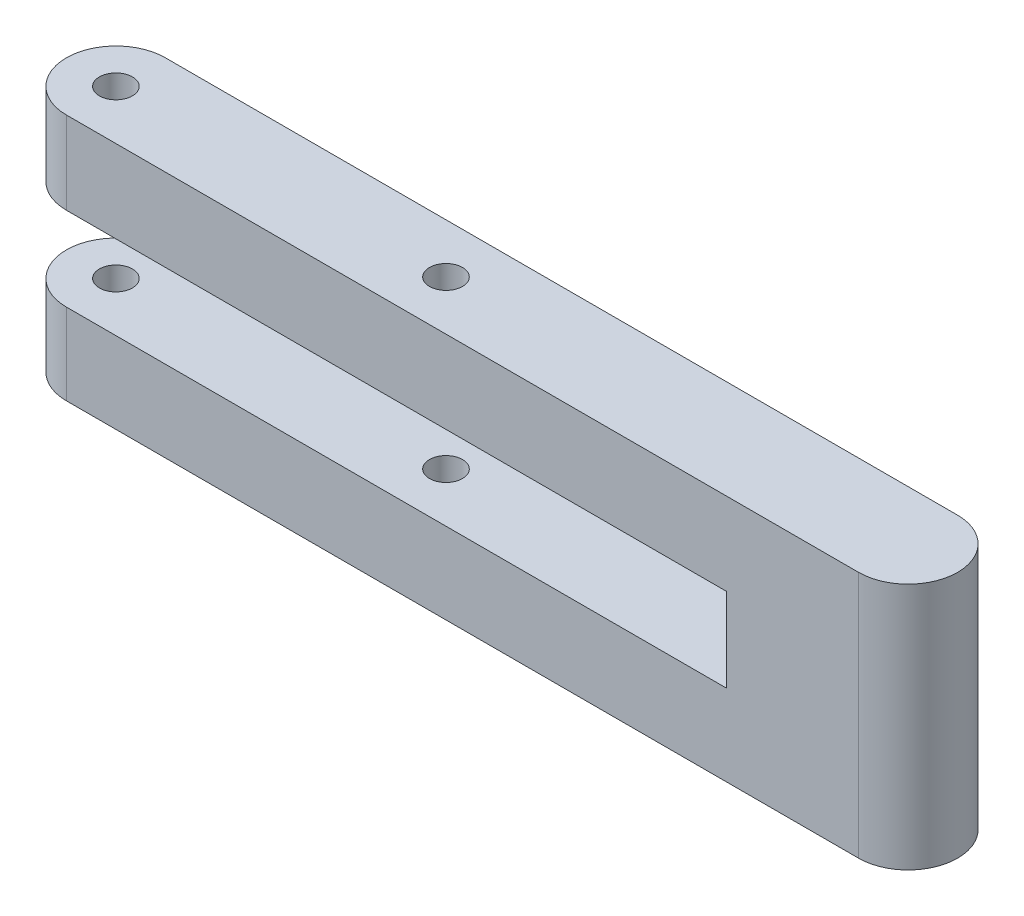
ISO-10303-21;
HEADER;
FILE_DESCRIPTION(('STEP AP214'),'2;1');
FILE_NAME('part.step','',(''),(''),'','','');
FILE_SCHEMA(('AUTOMOTIVE_DESIGN { 1 0 10303 214 1 1 1 1 }'));
ENDSEC;
DATA;
#1=APPLICATION_CONTEXT('core data for automotive mechanical design processes');
#2=APPLICATION_PROTOCOL_DEFINITION('international standard','automotive_design',2000,#1);
#3=PRODUCT_CONTEXT('',#1,'mechanical');
#4=PRODUCT('Part','Part','',(#3));
#5=PRODUCT_RELATED_PRODUCT_CATEGORY('part','',(#4));
#6=PRODUCT_DEFINITION_FORMATION('','',#4);
#7=PRODUCT_DEFINITION_CONTEXT('part definition',#1,'design');
#8=PRODUCT_DEFINITION('design','',#6,#7);
#9=PRODUCT_DEFINITION_SHAPE('','',#8);
#10=(LENGTH_UNIT() NAMED_UNIT(*) SI_UNIT(.MILLI.,.METRE.));
#11=(NAMED_UNIT(*) PLANE_ANGLE_UNIT() SI_UNIT($,.RADIAN.));
#12=(NAMED_UNIT(*) SI_UNIT($,.STERADIAN.) SOLID_ANGLE_UNIT());
#13=UNCERTAINTY_MEASURE_WITH_UNIT(LENGTH_MEASURE(1.E-05),#10,'distance_accuracy_value','');
#14=(GEOMETRIC_REPRESENTATION_CONTEXT(3) GLOBAL_UNCERTAINTY_ASSIGNED_CONTEXT((#13)) GLOBAL_UNIT_ASSIGNED_CONTEXT((#10,
#11,#12)) REPRESENTATION_CONTEXT('',''));
#15=CARTESIAN_POINT('',(0.,0.,0.));
#16=DIRECTION('',(0.,0.,1.));
#17=DIRECTION('',(1.,0.,0.));
#18=AXIS2_PLACEMENT_3D('',#15,#16,#17);
#19=CARTESIAN_POINT('',(-50.8,38.1,0.));
#20=DIRECTION('',(0.,-1.,0.));
#21=DIRECTION('',(0.,0.,-1.));
#22=AXIS2_PLACEMENT_3D('',#19,#20,#21);
#23=CYLINDRICAL_SURFACE('',#22,7.62);
#24=CARTESIAN_POINT('',(-50.8,12.499999892,0.));
#25=DIRECTION('',(0.,1.,0.));
#26=DIRECTION('',(0.,0.,1.));
#27=AXIS2_PLACEMENT_3D('',#24,#25,#26);
#28=CIRCLE('',#27,7.62);
#29=CARTESIAN_POINT('',(-50.8,12.499999892,-7.62));
#30=VERTEX_POINT('',#29);
#31=CARTESIAN_POINT('',(-50.8,12.499999892,7.62));
#32=VERTEX_POINT('',#31);
#33=EDGE_CURVE('E119',#30,#32,#28,.T.);
#34=ORIENTED_EDGE('',*,*,#33,.F.);
#35=DIRECTION('',(0.,-1.,0.));
#36=VECTOR('',#35,1.);
#37=CARTESIAN_POINT('',(-50.8,38.1,-7.62));
#38=LINE('',#37,#36);
#39=CARTESIAN_POINT('',(-50.8,0.,-7.62));
#40=VERTEX_POINT('',#39);
#41=EDGE_CURVE('E89',#30,#40,#38,.T.);
#42=ORIENTED_EDGE('',*,*,#41,.T.);
#43=CARTESIAN_POINT('',(-50.8,0.,0.));
#44=DIRECTION('',(0.,1.,0.));
#45=DIRECTION('',(0.,0.,1.));
#46=AXIS2_PLACEMENT_3D('',#43,#44,#45);
#47=CIRCLE('',#46,7.62);
#48=CARTESIAN_POINT('',(-50.8,0.,7.62));
#49=VERTEX_POINT('',#48);
#50=EDGE_CURVE('E166',#40,#49,#47,.T.);
#51=ORIENTED_EDGE('',*,*,#50,.T.);
#52=DIRECTION('',(0.,-1.,0.));
#53=VECTOR('',#52,1.);
#54=CARTESIAN_POINT('',(-50.8,38.1,7.62));
#55=LINE('',#54,#53);
#56=EDGE_CURVE('E50',#32,#49,#55,.T.);
#57=ORIENTED_EDGE('',*,*,#56,.F.);
#58=EDGE_LOOP('',(#34,#42,#51,#57));
#59=FACE_BOUND('',#58,.T.);
#60=ADVANCED_FACE('F41',(#59),#23,.T.);
#61=CARTESIAN_POINT('',(0.,0.,0.));
#62=DIRECTION('',(0.,1.,0.));
#63=DIRECTION('',(0.,0.,1.));
#64=AXIS2_PLACEMENT_3D('',#61,#62,#63);
#65=CYLINDRICAL_SURFACE('',#64,2.54);
#66=CARTESIAN_POINT('',(0.,0.,0.));
#67=DIRECTION('',(0.,1.,0.));
#68=DIRECTION('',(0.,0.,1.));
#69=AXIS2_PLACEMENT_3D('',#66,#67,#68);
#70=CIRCLE('',#69,2.54);
#71=CARTESIAN_POINT('',(0.,0.,2.54));
#72=VERTEX_POINT('',#71);
#73=EDGE_CURVE('E162',#72,#72,#70,.T.);
#74=CARTESIAN_POINT('',(0.,12.499999892,0.));
#75=DIRECTION('',(0.,1.,0.));
#76=DIRECTION('',(0.,0.,1.));
#77=AXIS2_PLACEMENT_3D('',#74,#75,#76);
#78=CIRCLE('',#77,2.54);
#79=CARTESIAN_POINT('',(0.,12.499999892,2.54));
#80=VERTEX_POINT('',#79);
#81=EDGE_CURVE('E146',#80,#80,#78,.F.);
#82=CARTESIAN_POINT('',(0.,0.,2.54));
#83=CARTESIAN_POINT('',(0.,0.130208332208333,2.54));
#84=CARTESIAN_POINT('',(0.,0.260416664416667,2.54));
#85=CARTESIAN_POINT('',(0.,0.520833328833333,2.54));
#86=CARTESIAN_POINT('',(0.,0.651041661041667,2.54));
#87=CARTESIAN_POINT('',(0.,0.911458325458333,2.54));
#88=CARTESIAN_POINT('',(0.,1.04166665766667,2.54));
#89=CARTESIAN_POINT('',(0.,1.30208332208333,2.54));
#90=CARTESIAN_POINT('',(0.,1.43229165429167,2.54));
#91=CARTESIAN_POINT('',(0.,1.69270831870833,2.54));
#92=CARTESIAN_POINT('',(0.,1.82291665091667,2.54));
#93=CARTESIAN_POINT('',(0.,2.08333331533333,2.54));
#94=CARTESIAN_POINT('',(0.,2.21354164754167,2.54));
#95=CARTESIAN_POINT('',(0.,2.47395831195833,2.54));
#96=CARTESIAN_POINT('',(0.,2.60416664416667,2.54));
#97=CARTESIAN_POINT('',(0.,2.86458330858333,2.54));
#98=CARTESIAN_POINT('',(0.,2.99479164079167,2.54));
#99=CARTESIAN_POINT('',(0.,3.25520830520833,2.54));
#100=CARTESIAN_POINT('',(0.,3.38541663741667,2.54));
#101=CARTESIAN_POINT('',(0.,3.64583330183333,2.54));
#102=CARTESIAN_POINT('',(0.,3.77604163404167,2.54));
#103=CARTESIAN_POINT('',(0.,4.03645829845833,2.54));
#104=CARTESIAN_POINT('',(0.,4.16666663066667,2.54));
#105=CARTESIAN_POINT('',(0.,4.42708329508333,2.54));
#106=CARTESIAN_POINT('',(0.,4.55729162729167,2.54));
#107=CARTESIAN_POINT('',(0.,4.81770829170833,2.54));
#108=CARTESIAN_POINT('',(0.,4.94791662391667,2.54));
#109=CARTESIAN_POINT('',(0.,5.20833328833333,2.54));
#110=CARTESIAN_POINT('',(0.,5.33854162054167,2.54));
#111=CARTESIAN_POINT('',(0.,5.59895828495833,2.54));
#112=CARTESIAN_POINT('',(0.,5.72916661716667,2.54));
#113=CARTESIAN_POINT('',(0.,5.98958328158333,2.54));
#114=CARTESIAN_POINT('',(0.,6.11979161379167,2.54));
#115=CARTESIAN_POINT('',(0.,6.38020827820833,2.54));
#116=CARTESIAN_POINT('',(0.,6.51041661041667,2.54));
#117=CARTESIAN_POINT('',(0.,6.77083327483333,2.54));
#118=CARTESIAN_POINT('',(0.,6.90104160704167,2.54));
#119=CARTESIAN_POINT('',(0.,7.16145827145833,2.54));
#120=CARTESIAN_POINT('',(0.,7.29166660366667,2.54));
#121=CARTESIAN_POINT('',(0.,7.55208326808333,2.54));
#122=CARTESIAN_POINT('',(0.,7.68229160029167,2.54));
#123=CARTESIAN_POINT('',(0.,7.94270826470833,2.54));
#124=CARTESIAN_POINT('',(0.,8.07291659691667,2.54));
#125=CARTESIAN_POINT('',(0.,8.33333326133333,2.54));
#126=CARTESIAN_POINT('',(0.,8.46354159354167,2.54));
#127=CARTESIAN_POINT('',(0.,8.72395825795833,2.54));
#128=CARTESIAN_POINT('',(0.,8.85416659016667,2.54));
#129=CARTESIAN_POINT('',(0.,9.11458325458333,2.54));
#130=CARTESIAN_POINT('',(0.,9.24479158679167,2.54));
#131=CARTESIAN_POINT('',(0.,9.50520825120834,2.54));
#132=CARTESIAN_POINT('',(0.,9.63541658341667,2.54));
#133=CARTESIAN_POINT('',(0.,9.89583324783333,2.54));
#134=CARTESIAN_POINT('',(0.,10.0260415800417,2.54));
#135=CARTESIAN_POINT('',(0.,10.2864582444583,2.54));
#136=CARTESIAN_POINT('',(0.,10.4166665766667,2.54));
#137=CARTESIAN_POINT('',(0.,10.6770832410833,2.54));
#138=CARTESIAN_POINT('',(0.,10.8072915732917,2.54));
#139=CARTESIAN_POINT('',(0.,11.0677082377083,2.54));
#140=CARTESIAN_POINT('',(0.,11.1979165699167,2.54));
#141=CARTESIAN_POINT('',(0.,11.4583332343333,2.54));
#142=CARTESIAN_POINT('',(0.,11.5885415665417,2.54));
#143=CARTESIAN_POINT('',(0.,11.8489582309583,2.54));
#144=CARTESIAN_POINT('',(0.,11.9791665631667,2.54));
#145=CARTESIAN_POINT('',(0.,12.2395832275833,2.54));
#146=CARTESIAN_POINT('',(0.,12.3697915597917,2.54));
#147=CARTESIAN_POINT('',(0.,12.499999892,2.54));
#148=B_SPLINE_CURVE_WITH_KNOTS('',3,(#82,#83,#84,#85,#86,#87,#88,#89,#90,#91,#92,#93,#94,#95,
#96,#97,#98,#99,#100,#101,#102,#103,#104,#105,#106,#107,#108,#109,#110,#111,#112,#113,#114,#115,
#116,#117,#118,#119,#120,#121,#122,#123,#124,#125,#126,#127,#128,#129,#130,#131,#132,#133,#134,
#135,#136,#137,#138,#139,#140,#141,#142,#143,#144,#145,#146,#147),.UNSPECIFIED.,.F.,.F.,(4,2,2,
2,2,2,2,2,2,2,2,2,2,2,2,2,2,2,2,2,2,2,2,2,2,2,2,2,2,2,2,2,4),(0.,0.390624996625,0.78124999325,
1.171874989875,1.5624999865,1.953124983125,2.34374997975,2.734374976375,3.124999973,
3.515624969625,3.90624996625,4.296874962875,4.6874999595,5.078124956125,5.46874995275,
5.859374949375,6.249999946,6.640624942625,7.03124993925,7.421874935875,7.8124999325,
8.203124929125,8.59374992575,8.984374922375,9.374999919,9.765624915625,10.15624991225,
10.546874908875,10.9374999055,11.328124902125,11.71874989875,12.109374895375,12.499999892),.UNSPECIFIED.);
#149=EDGE_CURVE('BSEAM220',#72,#80,#148,.T.);
#150=ORIENTED_EDGE('',*,*,#73,.F.);
#151=ORIENTED_EDGE('',*,*,#81,.F.);
#152=ORIENTED_EDGE('',*,*,#149,.T.);
#153=ORIENTED_EDGE('',*,*,#149,.F.);
#154=EDGE_LOOP('',(#150,#152,#151,#153));
#155=FACE_BOUND('',#154,.T.);
#156=ADVANCED_FACE('F220',(#155),#65,.F.);
#157=CARTESIAN_POINT('',(-50.8,0.,0.));
#158=DIRECTION('',(0.,1.,0.));
#159=DIRECTION('',(0.,0.,1.));
#160=AXIS2_PLACEMENT_3D('',#157,#158,#159);
#161=CYLINDRICAL_SURFACE('',#160,2.54);
#162=CARTESIAN_POINT('',(-50.8,0.,0.));
#163=DIRECTION('',(0.,1.,0.));
#164=DIRECTION('',(0.,0.,1.));
#165=AXIS2_PLACEMENT_3D('',#162,#163,#164);
#166=CIRCLE('',#165,2.54);
#167=CARTESIAN_POINT('',(-50.8,0.,2.54));
#168=VERTEX_POINT('',#167);
#169=EDGE_CURVE('E163',#168,#168,#166,.T.);
#170=CARTESIAN_POINT('',(-50.8,12.499999892,0.));
#171=DIRECTION('',(0.,1.,0.));
#172=DIRECTION('',(0.,0.,1.));
#173=AXIS2_PLACEMENT_3D('',#170,#171,#172);
#174=CIRCLE('',#173,2.54);
#175=CARTESIAN_POINT('',(-50.8,12.499999892,2.54));
#176=VERTEX_POINT('',#175);
#177=EDGE_CURVE('E144',#176,#176,#174,.F.);
#178=CARTESIAN_POINT('',(-50.8,0.,2.54));
#179=CARTESIAN_POINT('',(-50.8,0.130208332208333,2.54));
#180=CARTESIAN_POINT('',(-50.8,0.260416664416667,2.54));
#181=CARTESIAN_POINT('',(-50.8,0.520833328833333,2.54));
#182=CARTESIAN_POINT('',(-50.8,0.651041661041667,2.54));
#183=CARTESIAN_POINT('',(-50.8,0.911458325458333,2.54));
#184=CARTESIAN_POINT('',(-50.8,1.04166665766667,2.54));
#185=CARTESIAN_POINT('',(-50.8,1.30208332208333,2.54));
#186=CARTESIAN_POINT('',(-50.8,1.43229165429167,2.54));
#187=CARTESIAN_POINT('',(-50.8,1.69270831870833,2.54));
#188=CARTESIAN_POINT('',(-50.8,1.82291665091667,2.54));
#189=CARTESIAN_POINT('',(-50.8,2.08333331533333,2.54));
#190=CARTESIAN_POINT('',(-50.8,2.21354164754167,2.54));
#191=CARTESIAN_POINT('',(-50.8,2.47395831195833,2.54));
#192=CARTESIAN_POINT('',(-50.8,2.60416664416667,2.54));
#193=CARTESIAN_POINT('',(-50.8,2.86458330858333,2.54));
#194=CARTESIAN_POINT('',(-50.8,2.99479164079167,2.54));
#195=CARTESIAN_POINT('',(-50.8,3.25520830520833,2.54));
#196=CARTESIAN_POINT('',(-50.8,3.38541663741667,2.54));
#197=CARTESIAN_POINT('',(-50.8,3.64583330183333,2.54));
#198=CARTESIAN_POINT('',(-50.8,3.77604163404167,2.54));
#199=CARTESIAN_POINT('',(-50.8,4.03645829845833,2.54));
#200=CARTESIAN_POINT('',(-50.8,4.16666663066667,2.54));
#201=CARTESIAN_POINT('',(-50.8,4.42708329508333,2.54));
#202=CARTESIAN_POINT('',(-50.8,4.55729162729167,2.54));
#203=CARTESIAN_POINT('',(-50.8,4.81770829170833,2.54));
#204=CARTESIAN_POINT('',(-50.8,4.94791662391667,2.54));
#205=CARTESIAN_POINT('',(-50.8,5.20833328833333,2.54));
#206=CARTESIAN_POINT('',(-50.8,5.33854162054167,2.54));
#207=CARTESIAN_POINT('',(-50.8,5.59895828495833,2.54));
#208=CARTESIAN_POINT('',(-50.8,5.72916661716667,2.54));
#209=CARTESIAN_POINT('',(-50.8,5.98958328158333,2.54));
#210=CARTESIAN_POINT('',(-50.8,6.11979161379167,2.54));
#211=CARTESIAN_POINT('',(-50.8,6.38020827820833,2.54));
#212=CARTESIAN_POINT('',(-50.8,6.51041661041667,2.54));
#213=CARTESIAN_POINT('',(-50.8,6.77083327483333,2.54));
#214=CARTESIAN_POINT('',(-50.8,6.90104160704167,2.54));
#215=CARTESIAN_POINT('',(-50.8,7.16145827145833,2.54));
#216=CARTESIAN_POINT('',(-50.8,7.29166660366667,2.54));
#217=CARTESIAN_POINT('',(-50.8,7.55208326808333,2.54));
#218=CARTESIAN_POINT('',(-50.8,7.68229160029167,2.54));
#219=CARTESIAN_POINT('',(-50.8,7.94270826470833,2.54));
#220=CARTESIAN_POINT('',(-50.8,8.07291659691667,2.54));
#221=CARTESIAN_POINT('',(-50.8,8.33333326133333,2.54));
#222=CARTESIAN_POINT('',(-50.8,8.46354159354167,2.54));
#223=CARTESIAN_POINT('',(-50.8,8.72395825795833,2.54));
#224=CARTESIAN_POINT('',(-50.8,8.85416659016667,2.54));
#225=CARTESIAN_POINT('',(-50.8,9.11458325458333,2.54));
#226=CARTESIAN_POINT('',(-50.8,9.24479158679167,2.54));
#227=CARTESIAN_POINT('',(-50.8,9.50520825120834,2.54));
#228=CARTESIAN_POINT('',(-50.8,9.63541658341667,2.54));
#229=CARTESIAN_POINT('',(-50.8,9.89583324783333,2.54));
#230=CARTESIAN_POINT('',(-50.8,10.0260415800417,2.54));
#231=CARTESIAN_POINT('',(-50.8,10.2864582444583,2.54));
#232=CARTESIAN_POINT('',(-50.8,10.4166665766667,2.54));
#233=CARTESIAN_POINT('',(-50.8,10.6770832410833,2.54));
#234=CARTESIAN_POINT('',(-50.8,10.8072915732917,2.54));
#235=CARTESIAN_POINT('',(-50.8,11.0677082377083,2.54));
#236=CARTESIAN_POINT('',(-50.8,11.1979165699167,2.54));
#237=CARTESIAN_POINT('',(-50.8,11.4583332343333,2.54));
#238=CARTESIAN_POINT('',(-50.8,11.5885415665417,2.54));
#239=CARTESIAN_POINT('',(-50.8,11.8489582309583,2.54));
#240=CARTESIAN_POINT('',(-50.8,11.9791665631667,2.54));
#241=CARTESIAN_POINT('',(-50.8,12.2395832275833,2.54));
#242=CARTESIAN_POINT('',(-50.8,12.3697915597917,2.54));
#243=CARTESIAN_POINT('',(-50.8,12.499999892,2.54));
#244=B_SPLINE_CURVE_WITH_KNOTS('',3,(#178,#179,#180,#181,#182,#183,#184,#185,#186,#187,#188,
#189,#190,#191,#192,#193,#194,#195,#196,#197,#198,#199,#200,#201,#202,#203,#204,#205,#206,#207,
#208,#209,#210,#211,#212,#213,#214,#215,#216,#217,#218,#219,#220,#221,#222,#223,#224,#225,#226,
#227,#228,#229,#230,#231,#232,#233,#234,#235,#236,#237,#238,#239,#240,#241,#242,#243),
.UNSPECIFIED.,.F.,.F.,(4,2,2,2,2,2,2,2,2,2,2,2,2,2,2,2,2,2,2,2,2,2,2,2,2,2,2,2,2,2,2,2,4),(0.,
0.390624996625,0.78124999325,1.171874989875,1.5624999865,1.953124983125,2.34374997975,
2.734374976375,3.124999973,3.515624969625,3.90624996625,4.296874962875,4.6874999595,
5.078124956125,5.46874995275,5.859374949375,6.249999946,6.640624942625,7.03124993925,
7.421874935875,7.8124999325,8.203124929125,8.59374992575,8.984374922375,9.374999919,
9.765624915625,10.15624991225,10.546874908875,10.9374999055,11.328124902125,11.71874989875,
12.109374895375,12.499999892),.UNSPECIFIED.);
#245=EDGE_CURVE('BSEAM225',#168,#176,#244,.T.);
#246=ORIENTED_EDGE('',*,*,#169,.F.);
#247=ORIENTED_EDGE('',*,*,#177,.F.);
#248=ORIENTED_EDGE('',*,*,#245,.T.);
#249=ORIENTED_EDGE('',*,*,#245,.F.);
#250=EDGE_LOOP('',(#246,#248,#247,#249));
#251=FACE_BOUND('',#250,.T.);
#252=ADVANCED_FACE('F225',(#251),#161,.F.);
#253=CARTESIAN_POINT('',(-50.8,38.1,-7.62));
#254=VERTEX_POINT('',#253);
#255=CARTESIAN_POINT('',(-50.8,25.4,-7.62));
#256=VERTEX_POINT('',#255);
#257=EDGE_CURVE('E132',#254,#256,#38,.T.);
#258=ORIENTED_EDGE('',*,*,#257,.T.);
#259=CARTESIAN_POINT('',(-50.8,25.4,0.));
#260=DIRECTION('',(0.,1.,0.));
#261=DIRECTION('',(0.,0.,1.));
#262=AXIS2_PLACEMENT_3D('',#259,#260,#261);
#263=CIRCLE('',#262,7.62);
#264=CARTESIAN_POINT('',(-50.8,25.4,7.62));
#265=VERTEX_POINT('',#264);
#266=EDGE_CURVE('E196',#256,#265,#263,.T.);
#267=ORIENTED_EDGE('',*,*,#266,.T.);
#268=CARTESIAN_POINT('',(-50.8,38.1,7.62));
#269=VERTEX_POINT('',#268);
#270=EDGE_CURVE('E11',#269,#265,#55,.T.);
#271=ORIENTED_EDGE('',*,*,#270,.F.);
#272=CARTESIAN_POINT('',(-50.8,38.1,0.));
#273=DIRECTION('',(0.,1.,0.));
#274=DIRECTION('',(0.,0.,1.));
#275=AXIS2_PLACEMENT_3D('',#272,#273,#274);
#276=CIRCLE('',#275,7.62);
#277=EDGE_CURVE('E175',#254,#269,#276,.T.);
#278=ORIENTED_EDGE('',*,*,#277,.F.);
#279=EDGE_LOOP('',(#258,#267,#271,#278));
#280=FACE_BOUND('',#279,.T.);
#281=ADVANCED_FACE('F43',(#280),#23,.T.);
#282=CARTESIAN_POINT('',(-50.8,38.1,7.62));
#283=DIRECTION('',(0.,0.,-1.));
#284=DIRECTION('',(-1.,0.,0.));
#285=AXIS2_PLACEMENT_3D('',#282,#283,#284);
#286=PLANE('',#285);
#287=ORIENTED_EDGE('',*,*,#270,.T.);
#288=DIRECTION('',(1.,0.,0.));
#289=VECTOR('',#288,1.);
#290=CARTESIAN_POINT('',(0.,25.4,7.62));
#291=LINE('',#290,#289);
#292=CARTESIAN_POINT('',(50.8,25.4,7.62));
#293=VERTEX_POINT('',#292);
#294=EDGE_CURVE('E199',#265,#293,#291,.T.);
#295=ORIENTED_EDGE('',*,*,#294,.T.);
#296=DIRECTION('',(0.,-1.,0.));
#297=VECTOR('',#296,1.);
#298=CARTESIAN_POINT('',(50.8,25.4,7.62));
#299=LINE('',#298,#297);
#300=CARTESIAN_POINT('',(50.8,12.499999892,7.62));
#301=VERTEX_POINT('',#300);
#302=EDGE_CURVE('E147',#293,#301,#299,.T.);
#303=ORIENTED_EDGE('',*,*,#302,.T.);
#304=DIRECTION('',(1.,0.,0.));
#305=VECTOR('',#304,1.);
#306=CARTESIAN_POINT('',(0.,12.499999892,7.62));
#307=LINE('',#306,#305);
#308=EDGE_CURVE('E125',#32,#301,#307,.T.);
#309=ORIENTED_EDGE('',*,*,#308,.F.);
#310=ORIENTED_EDGE('',*,*,#56,.T.);
#311=DIRECTION('',(1.,0.,0.));
#312=VECTOR('',#311,1.);
#313=CARTESIAN_POINT('',(-50.8,0.,7.62));
#314=LINE('',#313,#312);
#315=CARTESIAN_POINT('',(71.12,0.,7.62));
#316=VERTEX_POINT('',#315);
#317=EDGE_CURVE('E180',#49,#316,#314,.T.);
#318=ORIENTED_EDGE('',*,*,#317,.T.);
#319=DIRECTION('',(0.,-1.,0.));
#320=VECTOR('',#319,1.);
#321=CARTESIAN_POINT('',(71.12,38.1,7.62));
#322=LINE('',#321,#320);
#323=CARTESIAN_POINT('',(71.12,38.1,7.62));
#324=VERTEX_POINT('',#323);
#325=EDGE_CURVE('E142',#324,#316,#322,.T.);
#326=ORIENTED_EDGE('',*,*,#325,.F.);
#327=DIRECTION('',(1.,0.,0.));
#328=VECTOR('',#327,1.);
#329=CARTESIAN_POINT('',(-50.8,38.1,7.62));
#330=LINE('',#329,#328);
#331=EDGE_CURVE('E96',#269,#324,#330,.T.);
#332=ORIENTED_EDGE('',*,*,#331,.F.);
#333=EDGE_LOOP('',(#287,#295,#303,#309,#310,#318,#326,#332));
#334=FACE_BOUND('',#333,.T.);
#335=ADVANCED_FACE('F190',(#334),#286,.F.);
#336=CARTESIAN_POINT('',(71.12,38.1,0.));
#337=DIRECTION('',(0.,-1.,0.));
#338=DIRECTION('',(0.,0.,-1.));
#339=AXIS2_PLACEMENT_3D('',#336,#337,#338);
#340=CYLINDRICAL_SURFACE('',#339,7.62);
#341=CARTESIAN_POINT('',(71.12,0.,0.));
#342=DIRECTION('',(0.,1.,0.));
#343=DIRECTION('',(0.,0.,1.));
#344=AXIS2_PLACEMENT_3D('',#341,#342,#343);
#345=CIRCLE('',#344,7.62);
#346=CARTESIAN_POINT('',(71.12,0.,-7.62));
#347=VERTEX_POINT('',#346);
#348=EDGE_CURVE('E181',#316,#347,#345,.T.);
#349=ORIENTED_EDGE('',*,*,#348,.T.);
#350=DIRECTION('',(0.,-1.,0.));
#351=VECTOR('',#350,1.);
#352=CARTESIAN_POINT('',(71.12,38.1,-7.62));
#353=LINE('',#352,#351);
#354=CARTESIAN_POINT('',(71.12,38.1,-7.62));
#355=VERTEX_POINT('',#354);
#356=EDGE_CURVE('E135',#355,#347,#353,.T.);
#357=ORIENTED_EDGE('',*,*,#356,.F.);
#358=CARTESIAN_POINT('',(71.12,38.1,0.));
#359=DIRECTION('',(0.,1.,0.));
#360=DIRECTION('',(0.,0.,1.));
#361=AXIS2_PLACEMENT_3D('',#358,#359,#360);
#362=CIRCLE('',#361,7.62);
#363=EDGE_CURVE('E136',#324,#355,#362,.T.);
#364=ORIENTED_EDGE('',*,*,#363,.F.);
#365=ORIENTED_EDGE('',*,*,#325,.T.);
#366=EDGE_LOOP('',(#349,#357,#364,#365));
#367=FACE_BOUND('',#366,.T.);
#368=ADVANCED_FACE('F185',(#367),#340,.T.);
#369=CARTESIAN_POINT('',(-50.8,38.1,-7.62));
#370=DIRECTION('',(0.,0.,1.));
#371=DIRECTION('',(1.,0.,0.));
#372=AXIS2_PLACEMENT_3D('',#369,#370,#371);
#373=PLANE('',#372);
#374=DIRECTION('',(0.,-1.,0.));
#375=VECTOR('',#374,1.);
#376=CARTESIAN_POINT('',(50.8,25.4,-7.62));
#377=LINE('',#376,#375);
#378=CARTESIAN_POINT('',(50.8,25.4,-7.62));
#379=VERTEX_POINT('',#378);
#380=CARTESIAN_POINT('',(50.8,12.499999892,-7.62));
#381=VERTEX_POINT('',#380);
#382=EDGE_CURVE('E152',#379,#381,#377,.T.);
#383=ORIENTED_EDGE('',*,*,#382,.F.);
#384=DIRECTION('',(1.,0.,0.));
#385=VECTOR('',#384,1.);
#386=CARTESIAN_POINT('',(0.,25.4,-7.62));
#387=LINE('',#386,#385);
#388=EDGE_CURVE('E192',#256,#379,#387,.T.);
#389=ORIENTED_EDGE('',*,*,#388,.F.);
#390=ORIENTED_EDGE('',*,*,#257,.F.);
#391=DIRECTION('',(-1.,0.,0.));
#392=VECTOR('',#391,1.);
#393=CARTESIAN_POINT('',(-50.8,38.1,-7.62));
#394=LINE('',#393,#392);
#395=EDGE_CURVE('E67',#355,#254,#394,.T.);
#396=ORIENTED_EDGE('',*,*,#395,.F.);
#397=ORIENTED_EDGE('',*,*,#356,.T.);
#398=DIRECTION('',(-1.,0.,0.));
#399=VECTOR('',#398,1.);
#400=CARTESIAN_POINT('',(-50.8,0.,-7.62));
#401=LINE('',#400,#399);
#402=EDGE_CURVE('E130',#347,#40,#401,.T.);
#403=ORIENTED_EDGE('',*,*,#402,.T.);
#404=ORIENTED_EDGE('',*,*,#41,.F.);
#405=DIRECTION('',(1.,0.,0.));
#406=VECTOR('',#405,1.);
#407=CARTESIAN_POINT('',(0.,12.499999892,-7.62));
#408=LINE('',#407,#406);
#409=EDGE_CURVE('E116',#30,#381,#408,.T.);
#410=ORIENTED_EDGE('',*,*,#409,.T.);
#411=EDGE_LOOP('',(#383,#389,#390,#396,#397,#403,#404,#410));
#412=FACE_BOUND('',#411,.T.);
#413=ADVANCED_FACE('F127',(#412),#373,.F.);
#414=CARTESIAN_POINT('',(-50.8,38.1,0.));
#415=DIRECTION('',(0.,1.,0.));
#416=DIRECTION('',(0.,0.,1.));
#417=AXIS2_PLACEMENT_3D('',#414,#415,#416);
#418=PLANE('',#417);
#419=CARTESIAN_POINT('',(-50.8,38.1,0.));
#420=DIRECTION('',(0.,1.,0.));
#421=DIRECTION('',(0.,0.,1.));
#422=AXIS2_PLACEMENT_3D('',#419,#420,#421);
#423=CIRCLE('',#422,2.54);
#424=CARTESIAN_POINT('',(-50.8,38.1,2.54));
#425=VERTEX_POINT('',#424);
#426=EDGE_CURVE('E167',#425,#425,#423,.T.);
#427=ORIENTED_EDGE('',*,*,#426,.F.);
#428=EDGE_LOOP('',(#427));
#429=FACE_BOUND('',#428,.T.);
#430=CARTESIAN_POINT('',(0.,38.1,0.));
#431=DIRECTION('',(0.,1.,0.));
#432=DIRECTION('',(0.,0.,1.));
#433=AXIS2_PLACEMENT_3D('',#430,#431,#432);
#434=CIRCLE('',#433,2.54);
#435=CARTESIAN_POINT('',(0.,38.1,2.54));
#436=VERTEX_POINT('',#435);
#437=EDGE_CURVE('E170',#436,#436,#434,.T.);
#438=ORIENTED_EDGE('',*,*,#437,.F.);
#439=EDGE_LOOP('',(#438));
#440=FACE_BOUND('',#439,.T.);
#441=ORIENTED_EDGE('',*,*,#277,.T.);
#442=ORIENTED_EDGE('',*,*,#331,.T.);
#443=ORIENTED_EDGE('',*,*,#363,.T.);
#444=ORIENTED_EDGE('',*,*,#395,.T.);
#445=EDGE_LOOP('',(#441,#442,#443,#444));
#446=FACE_BOUND('',#445,.T.);
#447=ADVANCED_FACE('F253',(#429,#440,#446),#418,.T.);
#448=CARTESIAN_POINT('',(-50.8,0.,0.));
#449=DIRECTION('',(0.,1.,0.));
#450=DIRECTION('',(0.,0.,1.));
#451=AXIS2_PLACEMENT_3D('',#448,#449,#450);
#452=PLANE('',#451);
#453=ORIENTED_EDGE('',*,*,#169,.T.);
#454=EDGE_LOOP('',(#453));
#455=FACE_BOUND('',#454,.T.);
#456=ORIENTED_EDGE('',*,*,#73,.T.);
#457=EDGE_LOOP('',(#456));
#458=FACE_BOUND('',#457,.T.);
#459=ORIENTED_EDGE('',*,*,#50,.F.);
#460=ORIENTED_EDGE('',*,*,#402,.F.);
#461=ORIENTED_EDGE('',*,*,#348,.F.);
#462=ORIENTED_EDGE('',*,*,#317,.F.);
#463=EDGE_LOOP('',(#459,#460,#461,#462));
#464=FACE_BOUND('',#463,.T.);
#465=ADVANCED_FACE('F189',(#455,#458,#464),#452,.F.);
#466=CARTESIAN_POINT('',(0.,25.4,0.));
#467=DIRECTION('',(0.,1.,0.));
#468=DIRECTION('',(0.,0.,1.));
#469=AXIS2_PLACEMENT_3D('',#466,#467,#468);
#470=CIRCLE('',#469,2.54);
#471=CARTESIAN_POINT('',(0.,25.4,2.54));
#472=VERTEX_POINT('',#471);
#473=EDGE_CURVE('E159',#472,#472,#470,.F.);
#474=CARTESIAN_POINT('',(0.,25.4,2.54));
#475=CARTESIAN_POINT('',(0.,25.5322916666667,2.54));
#476=CARTESIAN_POINT('',(0.,25.6645833333333,2.54));
#477=CARTESIAN_POINT('',(0.,25.9291666666667,2.54));
#478=CARTESIAN_POINT('',(0.,26.0614583333333,2.54));
#479=CARTESIAN_POINT('',(0.,26.3260416666667,2.54));
#480=CARTESIAN_POINT('',(0.,26.4583333333333,2.54));
#481=CARTESIAN_POINT('',(0.,26.7229166666667,2.54));
#482=CARTESIAN_POINT('',(0.,26.8552083333333,2.54));
#483=CARTESIAN_POINT('',(0.,27.1197916666667,2.54));
#484=CARTESIAN_POINT('',(0.,27.2520833333333,2.54));
#485=CARTESIAN_POINT('',(0.,27.5166666666667,2.54));
#486=CARTESIAN_POINT('',(0.,27.6489583333333,2.54));
#487=CARTESIAN_POINT('',(0.,27.9135416666667,2.54));
#488=CARTESIAN_POINT('',(0.,28.0458333333333,2.54));
#489=CARTESIAN_POINT('',(0.,28.3104166666667,2.54));
#490=CARTESIAN_POINT('',(0.,28.4427083333333,2.54));
#491=CARTESIAN_POINT('',(0.,28.7072916666667,2.54));
#492=CARTESIAN_POINT('',(0.,28.8395833333333,2.54));
#493=CARTESIAN_POINT('',(0.,29.1041666666667,2.54));
#494=CARTESIAN_POINT('',(0.,29.2364583333333,2.54));
#495=CARTESIAN_POINT('',(0.,29.5010416666667,2.54));
#496=CARTESIAN_POINT('',(0.,29.6333333333333,2.54));
#497=CARTESIAN_POINT('',(0.,29.8979166666667,2.54));
#498=CARTESIAN_POINT('',(0.,30.0302083333333,2.54));
#499=CARTESIAN_POINT('',(0.,30.2947916666667,2.54));
#500=CARTESIAN_POINT('',(0.,30.4270833333333,2.54));
#501=CARTESIAN_POINT('',(0.,30.6916666666667,2.54));
#502=CARTESIAN_POINT('',(0.,30.8239583333333,2.54));
#503=CARTESIAN_POINT('',(0.,31.0885416666667,2.54));
#504=CARTESIAN_POINT('',(0.,31.2208333333333,2.54));
#505=CARTESIAN_POINT('',(0.,31.4854166666667,2.54));
#506=CARTESIAN_POINT('',(0.,31.6177083333333,2.54));
#507=CARTESIAN_POINT('',(0.,31.8822916666667,2.54));
#508=CARTESIAN_POINT('',(0.,32.0145833333333,2.54));
#509=CARTESIAN_POINT('',(0.,32.2791666666667,2.54));
#510=CARTESIAN_POINT('',(0.,32.4114583333333,2.54));
#511=CARTESIAN_POINT('',(0.,32.6760416666667,2.54));
#512=CARTESIAN_POINT('',(0.,32.8083333333333,2.54));
#513=CARTESIAN_POINT('',(0.,33.0729166666667,2.54));
#514=CARTESIAN_POINT('',(0.,33.2052083333333,2.54));
#515=CARTESIAN_POINT('',(0.,33.4697916666667,2.54));
#516=CARTESIAN_POINT('',(0.,33.6020833333333,2.54));
#517=CARTESIAN_POINT('',(0.,33.8666666666667,2.54));
#518=CARTESIAN_POINT('',(0.,33.9989583333333,2.54));
#519=CARTESIAN_POINT('',(0.,34.2635416666667,2.54));
#520=CARTESIAN_POINT('',(0.,34.3958333333333,2.54));
#521=CARTESIAN_POINT('',(0.,34.6604166666667,2.54));
#522=CARTESIAN_POINT('',(0.,34.7927083333333,2.54));
#523=CARTESIAN_POINT('',(0.,35.0572916666667,2.54));
#524=CARTESIAN_POINT('',(0.,35.1895833333333,2.54));
#525=CARTESIAN_POINT('',(0.,35.4541666666667,2.54));
#526=CARTESIAN_POINT('',(0.,35.5864583333333,2.54));
#527=CARTESIAN_POINT('',(0.,35.8510416666667,2.54));
#528=CARTESIAN_POINT('',(0.,35.9833333333333,2.54));
#529=CARTESIAN_POINT('',(0.,36.2479166666667,2.54));
#530=CARTESIAN_POINT('',(0.,36.3802083333333,2.54));
#531=CARTESIAN_POINT('',(0.,36.6447916666667,2.54));
#532=CARTESIAN_POINT('',(0.,36.7770833333333,2.54));
#533=CARTESIAN_POINT('',(0.,37.0416666666667,2.54));
#534=CARTESIAN_POINT('',(0.,37.1739583333333,2.54));
#535=CARTESIAN_POINT('',(0.,37.4385416666667,2.54));
#536=CARTESIAN_POINT('',(0.,37.5708333333333,2.54));
#537=CARTESIAN_POINT('',(0.,37.8354166666667,2.54));
#538=CARTESIAN_POINT('',(0.,37.9677083333333,2.54));
#539=CARTESIAN_POINT('',(0.,38.1,2.54));
#540=B_SPLINE_CURVE_WITH_KNOTS('',3,(#474,#475,#476,#477,#478,#479,#480,#481,#482,#483,#484,
#485,#486,#487,#488,#489,#490,#491,#492,#493,#494,#495,#496,#497,#498,#499,#500,#501,#502,#503,
#504,#505,#506,#507,#508,#509,#510,#511,#512,#513,#514,#515,#516,#517,#518,#519,#520,#521,#522,
#523,#524,#525,#526,#527,#528,#529,#530,#531,#532,#533,#534,#535,#536,#537,#538,#539),
.UNSPECIFIED.,.F.,.F.,(4,2,2,2,2,2,2,2,2,2,2,2,2,2,2,2,2,2,2,2,2,2,2,2,2,2,2,2,2,2,2,2,4),(0.,
0.396875000000001,0.793749999999999,1.190625,1.5875,1.984375,2.38125,2.778125,3.175,3.571875,
3.96875,4.365625,4.7625,5.159375,5.55625000000001,5.953125,6.35,6.746875,7.14375,7.540625,
7.9375,8.334375,8.73125,9.128125,9.525,9.921875,10.31875,10.715625,11.1125,11.509375,11.90625,
12.303125,12.7),.UNSPECIFIED.);
#541=EDGE_CURVE('BSEAM228',#472,#436,#540,.T.);
#542=ORIENTED_EDGE('',*,*,#473,.T.);
#543=ORIENTED_EDGE('',*,*,#437,.T.);
#544=ORIENTED_EDGE('',*,*,#541,.T.);
#545=ORIENTED_EDGE('',*,*,#541,.F.);
#546=EDGE_LOOP('',(#542,#544,#543,#545));
#547=FACE_BOUND('',#546,.T.);
#548=ADVANCED_FACE('F228',(#547),#65,.F.);
#549=CARTESIAN_POINT('',(-50.8,25.4,0.));
#550=DIRECTION('',(0.,1.,0.));
#551=DIRECTION('',(0.,0.,1.));
#552=AXIS2_PLACEMENT_3D('',#549,#550,#551);
#553=CIRCLE('',#552,2.54);
#554=CARTESIAN_POINT('',(-50.8,25.4,2.54));
#555=VERTEX_POINT('',#554);
#556=EDGE_CURVE('E45',#555,#555,#553,.F.);
#557=CARTESIAN_POINT('',(-50.8,25.4,2.54));
#558=CARTESIAN_POINT('',(-50.8,25.5322916666667,2.54));
#559=CARTESIAN_POINT('',(-50.8,25.6645833333333,2.54));
#560=CARTESIAN_POINT('',(-50.8,25.9291666666667,2.54));
#561=CARTESIAN_POINT('',(-50.8,26.0614583333333,2.54));
#562=CARTESIAN_POINT('',(-50.8,26.3260416666667,2.54));
#563=CARTESIAN_POINT('',(-50.8,26.4583333333333,2.54));
#564=CARTESIAN_POINT('',(-50.8,26.7229166666667,2.54));
#565=CARTESIAN_POINT('',(-50.8,26.8552083333333,2.54));
#566=CARTESIAN_POINT('',(-50.8,27.1197916666667,2.54));
#567=CARTESIAN_POINT('',(-50.8,27.2520833333333,2.54));
#568=CARTESIAN_POINT('',(-50.8,27.5166666666667,2.54));
#569=CARTESIAN_POINT('',(-50.8,27.6489583333333,2.54));
#570=CARTESIAN_POINT('',(-50.8,27.9135416666667,2.54));
#571=CARTESIAN_POINT('',(-50.8,28.0458333333333,2.54));
#572=CARTESIAN_POINT('',(-50.8,28.3104166666667,2.54));
#573=CARTESIAN_POINT('',(-50.8,28.4427083333333,2.54));
#574=CARTESIAN_POINT('',(-50.8,28.7072916666667,2.54));
#575=CARTESIAN_POINT('',(-50.8,28.8395833333333,2.54));
#576=CARTESIAN_POINT('',(-50.8,29.1041666666667,2.54));
#577=CARTESIAN_POINT('',(-50.8,29.2364583333333,2.54));
#578=CARTESIAN_POINT('',(-50.8,29.5010416666667,2.54));
#579=CARTESIAN_POINT('',(-50.8,29.6333333333333,2.54));
#580=CARTESIAN_POINT('',(-50.8,29.8979166666667,2.54));
#581=CARTESIAN_POINT('',(-50.8,30.0302083333333,2.54));
#582=CARTESIAN_POINT('',(-50.8,30.2947916666667,2.54));
#583=CARTESIAN_POINT('',(-50.8,30.4270833333333,2.54));
#584=CARTESIAN_POINT('',(-50.8,30.6916666666667,2.54));
#585=CARTESIAN_POINT('',(-50.8,30.8239583333333,2.54));
#586=CARTESIAN_POINT('',(-50.8,31.0885416666667,2.54));
#587=CARTESIAN_POINT('',(-50.8,31.2208333333333,2.54));
#588=CARTESIAN_POINT('',(-50.8,31.4854166666667,2.54));
#589=CARTESIAN_POINT('',(-50.8,31.6177083333333,2.54));
#590=CARTESIAN_POINT('',(-50.8,31.8822916666667,2.54));
#591=CARTESIAN_POINT('',(-50.8,32.0145833333333,2.54));
#592=CARTESIAN_POINT('',(-50.8,32.2791666666667,2.54));
#593=CARTESIAN_POINT('',(-50.8,32.4114583333333,2.54));
#594=CARTESIAN_POINT('',(-50.8,32.6760416666667,2.54));
#595=CARTESIAN_POINT('',(-50.8,32.8083333333333,2.54));
#596=CARTESIAN_POINT('',(-50.8,33.0729166666667,2.54));
#597=CARTESIAN_POINT('',(-50.8,33.2052083333333,2.54));
#598=CARTESIAN_POINT('',(-50.8,33.4697916666667,2.54));
#599=CARTESIAN_POINT('',(-50.8,33.6020833333333,2.54));
#600=CARTESIAN_POINT('',(-50.8,33.8666666666667,2.54));
#601=CARTESIAN_POINT('',(-50.8,33.9989583333333,2.54));
#602=CARTESIAN_POINT('',(-50.8,34.2635416666667,2.54));
#603=CARTESIAN_POINT('',(-50.8,34.3958333333333,2.54));
#604=CARTESIAN_POINT('',(-50.8,34.6604166666667,2.54));
#605=CARTESIAN_POINT('',(-50.8,34.7927083333333,2.54));
#606=CARTESIAN_POINT('',(-50.8,35.0572916666667,2.54));
#607=CARTESIAN_POINT('',(-50.8,35.1895833333333,2.54));
#608=CARTESIAN_POINT('',(-50.8,35.4541666666667,2.54));
#609=CARTESIAN_POINT('',(-50.8,35.5864583333333,2.54));
#610=CARTESIAN_POINT('',(-50.8,35.8510416666667,2.54));
#611=CARTESIAN_POINT('',(-50.8,35.9833333333333,2.54));
#612=CARTESIAN_POINT('',(-50.8,36.2479166666667,2.54));
#613=CARTESIAN_POINT('',(-50.8,36.3802083333333,2.54));
#614=CARTESIAN_POINT('',(-50.8,36.6447916666667,2.54));
#615=CARTESIAN_POINT('',(-50.8,36.7770833333333,2.54));
#616=CARTESIAN_POINT('',(-50.8,37.0416666666667,2.54));
#617=CARTESIAN_POINT('',(-50.8,37.1739583333333,2.54));
#618=CARTESIAN_POINT('',(-50.8,37.4385416666667,2.54));
#619=CARTESIAN_POINT('',(-50.8,37.5708333333333,2.54));
#620=CARTESIAN_POINT('',(-50.8,37.8354166666667,2.54));
#621=CARTESIAN_POINT('',(-50.8,37.9677083333333,2.54));
#622=CARTESIAN_POINT('',(-50.8,38.1,2.54));
#623=B_SPLINE_CURVE_WITH_KNOTS('',3,(#557,#558,#559,#560,#561,#562,#563,#564,#565,#566,#567,
#568,#569,#570,#571,#572,#573,#574,#575,#576,#577,#578,#579,#580,#581,#582,#583,#584,#585,#586,
#587,#588,#589,#590,#591,#592,#593,#594,#595,#596,#597,#598,#599,#600,#601,#602,#603,#604,#605,
#606,#607,#608,#609,#610,#611,#612,#613,#614,#615,#616,#617,#618,#619,#620,#621,#622),
.UNSPECIFIED.,.F.,.F.,(4,2,2,2,2,2,2,2,2,2,2,2,2,2,2,2,2,2,2,2,2,2,2,2,2,2,2,2,2,2,2,2,4),(0.,
0.396875000000001,0.793749999999999,1.190625,1.5875,1.984375,2.38125,2.778125,3.175,3.571875,
3.96875,4.365625,4.7625,5.159375,5.55625000000001,5.953125,6.35,6.746875,7.14375,7.540625,
7.9375,8.334375,8.73125,9.128125,9.525,9.921875,10.31875,10.715625,11.1125,11.509375,11.90625,
12.303125,12.7),.UNSPECIFIED.);
#624=EDGE_CURVE('BSEAM235',#555,#425,#623,.T.);
#625=ORIENTED_EDGE('',*,*,#556,.T.);
#626=ORIENTED_EDGE('',*,*,#426,.T.);
#627=ORIENTED_EDGE('',*,*,#624,.T.);
#628=ORIENTED_EDGE('',*,*,#624,.F.);
#629=EDGE_LOOP('',(#625,#627,#626,#628));
#630=FACE_BOUND('',#629,.T.);
#631=ADVANCED_FACE('F235',(#630),#161,.F.);
#632=CARTESIAN_POINT('',(0.,25.4,0.));
#633=DIRECTION('',(0.,1.,0.));
#634=DIRECTION('',(0.,0.,1.));
#635=AXIS2_PLACEMENT_3D('',#632,#633,#634);
#636=PLANE('',#635);
#637=ORIENTED_EDGE('',*,*,#556,.F.);
#638=EDGE_LOOP('',(#637));
#639=FACE_BOUND('',#638,.T.);
#640=ORIENTED_EDGE('',*,*,#388,.T.);
#641=DIRECTION('',(0.,0.,1.));
#642=VECTOR('',#641,1.);
#643=CARTESIAN_POINT('',(50.8,25.4,0.));
#644=LINE('',#643,#642);
#645=EDGE_CURVE('E155',#379,#293,#644,.T.);
#646=ORIENTED_EDGE('',*,*,#645,.T.);
#647=ORIENTED_EDGE('',*,*,#294,.F.);
#648=ORIENTED_EDGE('',*,*,#266,.F.);
#649=EDGE_LOOP('',(#640,#646,#647,#648));
#650=FACE_BOUND('',#649,.T.);
#651=ORIENTED_EDGE('',*,*,#473,.F.);
#652=EDGE_LOOP('',(#651));
#653=FACE_BOUND('',#652,.T.);
#654=ADVANCED_FACE('F203',(#639,#650,#653),#636,.F.);
#655=CARTESIAN_POINT('',(0.,12.499999892,0.));
#656=DIRECTION('',(0.,1.,0.));
#657=DIRECTION('',(0.,0.,1.));
#658=AXIS2_PLACEMENT_3D('',#655,#656,#657);
#659=PLANE('',#658);
#660=ORIENTED_EDGE('',*,*,#409,.F.);
#661=ORIENTED_EDGE('',*,*,#33,.T.);
#662=ORIENTED_EDGE('',*,*,#308,.T.);
#663=DIRECTION('',(0.,0.,1.));
#664=VECTOR('',#663,1.);
#665=CARTESIAN_POINT('',(50.8,12.499999892,0.));
#666=LINE('',#665,#664);
#667=EDGE_CURVE('E58',#381,#301,#666,.T.);
#668=ORIENTED_EDGE('',*,*,#667,.F.);
#669=EDGE_LOOP('',(#660,#661,#662,#668));
#670=FACE_BOUND('',#669,.T.);
#671=ORIENTED_EDGE('',*,*,#177,.T.);
#672=EDGE_LOOP('',(#671));
#673=FACE_BOUND('',#672,.T.);
#674=ORIENTED_EDGE('',*,*,#81,.T.);
#675=EDGE_LOOP('',(#674));
#676=FACE_BOUND('',#675,.T.);
#677=ADVANCED_FACE('F117',(#670,#673,#676),#659,.T.);
#678=CARTESIAN_POINT('',(50.8,25.4,0.));
#679=DIRECTION('',(1.,0.,0.));
#680=DIRECTION('',(0.,0.,-1.));
#681=AXIS2_PLACEMENT_3D('',#678,#679,#680);
#682=PLANE('',#681);
#683=ORIENTED_EDGE('',*,*,#302,.F.);
#684=ORIENTED_EDGE('',*,*,#645,.F.);
#685=ORIENTED_EDGE('',*,*,#382,.T.);
#686=ORIENTED_EDGE('',*,*,#667,.T.);
#687=EDGE_LOOP('',(#683,#684,#685,#686));
#688=FACE_BOUND('',#687,.T.);
#689=ADVANCED_FACE('F210',(#688),#682,.F.);
#690=CLOSED_SHELL('',(#60,#156,#252,#281,#335,#368,#413,#447,#465,#548,#631,#654,#677,#689));
#691=MANIFOLD_SOLID_BREP('B2',#690);
#692=ADVANCED_BREP_SHAPE_REPRESENTATION('',(#18,#691),#14);
#693=SHAPE_DEFINITION_REPRESENTATION(#9,#692);
ENDSEC;
END-ISO-10303-21;
